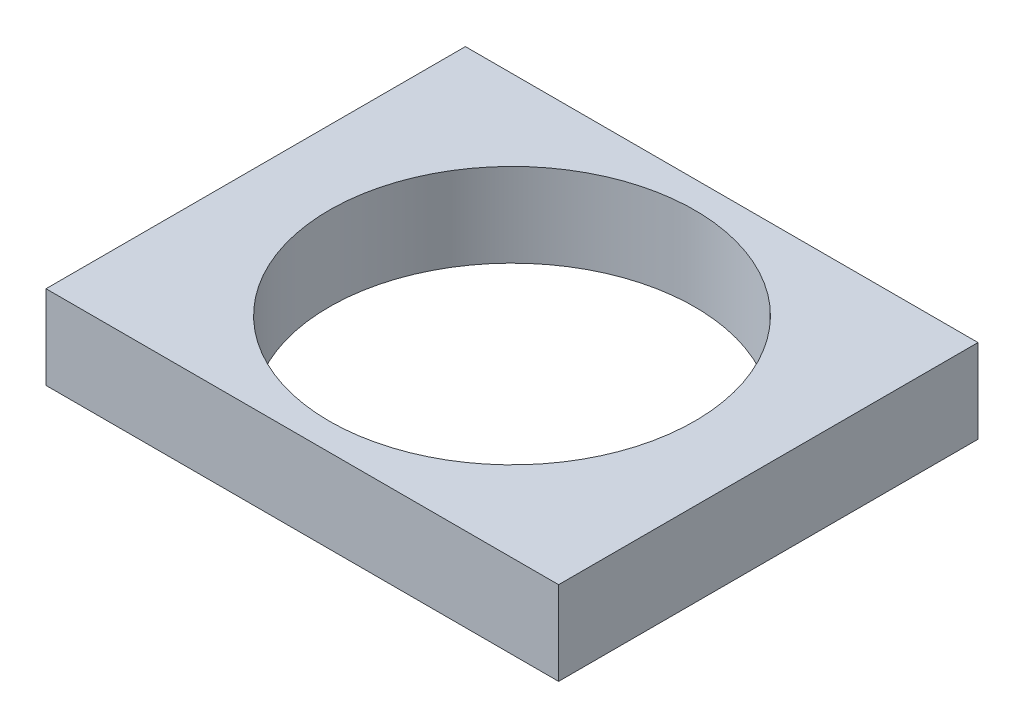
ISO-10303-21;
HEADER;
FILE_DESCRIPTION(('STEP AP214'),'2;1');
FILE_NAME('part.step','',(''),(''),'','','');
FILE_SCHEMA(('AUTOMOTIVE_DESIGN { 1 0 10303 214 1 1 1 1 }'));
ENDSEC;
DATA;
#1=APPLICATION_CONTEXT('core data for automotive mechanical design processes');
#2=APPLICATION_PROTOCOL_DEFINITION('international standard','automotive_design',2000,#1);
#3=PRODUCT_CONTEXT('',#1,'mechanical');
#4=PRODUCT('Part','Part','',(#3));
#5=PRODUCT_RELATED_PRODUCT_CATEGORY('part','',(#4));
#6=PRODUCT_DEFINITION_FORMATION('','',#4);
#7=PRODUCT_DEFINITION_CONTEXT('part definition',#1,'design');
#8=PRODUCT_DEFINITION('design','',#6,#7);
#9=PRODUCT_DEFINITION_SHAPE('','',#8);
#10=(LENGTH_UNIT() NAMED_UNIT(*) SI_UNIT(.MILLI.,.METRE.));
#11=(NAMED_UNIT(*) PLANE_ANGLE_UNIT() SI_UNIT($,.RADIAN.));
#12=(NAMED_UNIT(*) SI_UNIT($,.STERADIAN.) SOLID_ANGLE_UNIT());
#13=UNCERTAINTY_MEASURE_WITH_UNIT(LENGTH_MEASURE(1.E-05),#10,'distance_accuracy_value','');
#14=(GEOMETRIC_REPRESENTATION_CONTEXT(3) GLOBAL_UNCERTAINTY_ASSIGNED_CONTEXT((#13)) GLOBAL_UNIT_ASSIGNED_CONTEXT((#10,
#11,#12)) REPRESENTATION_CONTEXT('',''));
#15=CARTESIAN_POINT('',(0.,0.,0.));
#16=DIRECTION('',(0.,0.,1.));
#17=DIRECTION('',(1.,0.,0.));
#18=AXIS2_PLACEMENT_3D('',#15,#16,#17);
#19=CARTESIAN_POINT('',(0.,10.,0.));
#20=DIRECTION('',(0.,1.,0.));
#21=DIRECTION('',(0.,0.,1.));
#22=AXIS2_PLACEMENT_3D('',#19,#20,#21);
#23=PLANE('',#22);
#24=DIRECTION('',(0.,0.,1.));
#25=VECTOR('',#24,1.);
#26=CARTESIAN_POINT('',(-51.0541790263166,10.,-17.978222575415));
#27=LINE('',#26,#25);
#28=CARTESIAN_POINT('',(-51.0541790263166,10.,-17.978222575415));
#29=VERTEX_POINT('',#28);
#30=CARTESIAN_POINT('',(-51.0541790263166,10.,32.082684485409));
#31=VERTEX_POINT('',#30);
#32=EDGE_CURVE('E92',#29,#31,#27,.T.);
#33=ORIENTED_EDGE('',*,*,#32,.T.);
#34=DIRECTION('',(1.,0.,0.));
#35=VECTOR('',#34,1.);
#36=CARTESIAN_POINT('',(-51.0541790263166,10.,32.082684485409));
#37=LINE('',#36,#35);
#38=CARTESIAN_POINT('',(10.1313740480239,10.,32.082684485409));
#39=VERTEX_POINT('',#38);
#40=EDGE_CURVE('E87',#31,#39,#37,.T.);
#41=ORIENTED_EDGE('',*,*,#40,.T.);
#42=DIRECTION('',(0.,0.,-1.));
#43=VECTOR('',#42,1.);
#44=CARTESIAN_POINT('',(10.1313740480239,10.,-17.978222575415));
#45=LINE('',#44,#43);
#46=CARTESIAN_POINT('',(10.1313740480239,10.,-17.978222575415));
#47=VERTEX_POINT('',#46);
#48=EDGE_CURVE('E90',#39,#47,#45,.T.);
#49=ORIENTED_EDGE('',*,*,#48,.T.);
#50=DIRECTION('',(-1.,0.,0.));
#51=VECTOR('',#50,1.);
#52=CARTESIAN_POINT('',(-51.0541790263166,10.,-17.978222575415));
#53=LINE('',#52,#51);
#54=EDGE_CURVE('E57',#47,#29,#53,.T.);
#55=ORIENTED_EDGE('',*,*,#54,.T.);
#56=EDGE_LOOP('',(#33,#41,#49,#55));
#57=FACE_BOUND('',#56,.T.);
#58=CARTESIAN_POINT('',(-20.4614024891464,10.,7.05223095499703));
#59=DIRECTION('',(0.,1.,0.));
#60=DIRECTION('',(0.,0.,1.));
#61=AXIS2_PLACEMENT_3D('',#58,#59,#60);
#62=CIRCLE('',#61,21.8140253439407);
#63=CARTESIAN_POINT('',(-20.4614024891464,10.,28.8662562989377));
#64=VERTEX_POINT('',#63);
#65=EDGE_CURVE('E112',#64,#64,#62,.T.);
#66=ORIENTED_EDGE('',*,*,#65,.F.);
#67=EDGE_LOOP('',(#66));
#68=FACE_BOUND('',#67,.T.);
#69=ADVANCED_FACE('F39',(#57,#68),#23,.T.);
#70=CARTESIAN_POINT('',(0.,0.,0.));
#71=DIRECTION('',(0.,1.,0.));
#72=DIRECTION('',(0.,0.,1.));
#73=AXIS2_PLACEMENT_3D('',#70,#71,#72);
#74=PLANE('',#73);
#75=DIRECTION('',(0.,0.,1.));
#76=VECTOR('',#75,1.);
#77=CARTESIAN_POINT('',(-51.0541790263166,0.,-17.978222575415));
#78=LINE('',#77,#76);
#79=CARTESIAN_POINT('',(-51.0541790263166,0.,-17.978222575415));
#80=VERTEX_POINT('',#79);
#81=CARTESIAN_POINT('',(-51.0541790263166,0.,32.082684485409));
#82=VERTEX_POINT('',#81);
#83=EDGE_CURVE('E108',#80,#82,#78,.T.);
#84=ORIENTED_EDGE('',*,*,#83,.F.);
#85=DIRECTION('',(-1.,0.,0.));
#86=VECTOR('',#85,1.);
#87=CARTESIAN_POINT('',(-51.0541790263166,0.,-17.978222575415));
#88=LINE('',#87,#86);
#89=CARTESIAN_POINT('',(10.1313740480239,0.,-17.978222575415));
#90=VERTEX_POINT('',#89);
#91=EDGE_CURVE('E80',#90,#80,#88,.T.);
#92=ORIENTED_EDGE('',*,*,#91,.F.);
#93=DIRECTION('',(0.,0.,-1.));
#94=VECTOR('',#93,1.);
#95=CARTESIAN_POINT('',(10.1313740480239,0.,-17.978222575415));
#96=LINE('',#95,#94);
#97=CARTESIAN_POINT('',(10.1313740480239,0.,32.082684485409));
#98=VERTEX_POINT('',#97);
#99=EDGE_CURVE('E74',#98,#90,#96,.T.);
#100=ORIENTED_EDGE('',*,*,#99,.F.);
#101=DIRECTION('',(1.,0.,0.));
#102=VECTOR('',#101,1.);
#103=CARTESIAN_POINT('',(-51.0541790263166,0.,32.082684485409));
#104=LINE('',#103,#102);
#105=EDGE_CURVE('E97',#82,#98,#104,.T.);
#106=ORIENTED_EDGE('',*,*,#105,.F.);
#107=EDGE_LOOP('',(#84,#92,#100,#106));
#108=FACE_BOUND('',#107,.T.);
#109=CARTESIAN_POINT('',(-20.4614024891464,0.,7.05223095499703));
#110=DIRECTION('',(0.,1.,0.));
#111=DIRECTION('',(0.,0.,1.));
#112=AXIS2_PLACEMENT_3D('',#109,#110,#111);
#113=CIRCLE('',#112,21.8140253439407);
#114=CARTESIAN_POINT('',(-20.4614024891464,0.,28.8662562989377));
#115=VERTEX_POINT('',#114);
#116=EDGE_CURVE('E130',#115,#115,#113,.T.);
#117=ORIENTED_EDGE('',*,*,#116,.T.);
#118=EDGE_LOOP('',(#117));
#119=FACE_BOUND('',#118,.T.);
#120=ADVANCED_FACE('F125',(#108,#119),#74,.F.);
#121=CARTESIAN_POINT('',(-51.0541790263166,10.,-17.978222575415));
#122=DIRECTION('',(1.,0.,0.));
#123=DIRECTION('',(0.,0.,-1.));
#124=AXIS2_PLACEMENT_3D('',#121,#122,#123);
#125=PLANE('',#124);
#126=ORIENTED_EDGE('',*,*,#83,.T.);
#127=DIRECTION('',(0.,-1.,0.));
#128=VECTOR('',#127,1.);
#129=CARTESIAN_POINT('',(-51.0541790263166,10.,32.082684485409));
#130=LINE('',#129,#128);
#131=EDGE_CURVE('E11',#31,#82,#130,.T.);
#132=ORIENTED_EDGE('',*,*,#131,.F.);
#133=ORIENTED_EDGE('',*,*,#32,.F.);
#134=DIRECTION('',(0.,-1.,0.));
#135=VECTOR('',#134,1.);
#136=CARTESIAN_POINT('',(-51.0541790263166,10.,-17.978222575415));
#137=LINE('',#136,#135);
#138=EDGE_CURVE('E104',#29,#80,#137,.T.);
#139=ORIENTED_EDGE('',*,*,#138,.T.);
#140=EDGE_LOOP('',(#126,#132,#133,#139));
#141=FACE_BOUND('',#140,.T.);
#142=ADVANCED_FACE('F41',(#141),#125,.F.);
#143=CARTESIAN_POINT('',(-51.0541790263166,10.,32.082684485409));
#144=DIRECTION('',(0.,0.,-1.));
#145=DIRECTION('',(-1.,0.,0.));
#146=AXIS2_PLACEMENT_3D('',#143,#144,#145);
#147=PLANE('',#146);
#148=ORIENTED_EDGE('',*,*,#105,.T.);
#149=DIRECTION('',(0.,-1.,0.));
#150=VECTOR('',#149,1.);
#151=CARTESIAN_POINT('',(10.1313740480239,10.,32.082684485409));
#152=LINE('',#151,#150);
#153=EDGE_CURVE('E49',#39,#98,#152,.T.);
#154=ORIENTED_EDGE('',*,*,#153,.F.);
#155=ORIENTED_EDGE('',*,*,#40,.F.);
#156=ORIENTED_EDGE('',*,*,#131,.T.);
#157=EDGE_LOOP('',(#148,#154,#155,#156));
#158=FACE_BOUND('',#157,.T.);
#159=ADVANCED_FACE('F96',(#158),#147,.F.);
#160=CARTESIAN_POINT('',(10.1313740480239,10.,-17.978222575415));
#161=DIRECTION('',(-1.,0.,0.));
#162=DIRECTION('',(0.,0.,1.));
#163=AXIS2_PLACEMENT_3D('',#160,#161,#162);
#164=PLANE('',#163);
#165=ORIENTED_EDGE('',*,*,#99,.T.);
#166=DIRECTION('',(0.,-1.,0.));
#167=VECTOR('',#166,1.);
#168=CARTESIAN_POINT('',(10.1313740480239,10.,-17.978222575415));
#169=LINE('',#168,#167);
#170=EDGE_CURVE('E99',#47,#90,#169,.T.);
#171=ORIENTED_EDGE('',*,*,#170,.F.);
#172=ORIENTED_EDGE('',*,*,#48,.F.);
#173=ORIENTED_EDGE('',*,*,#153,.T.);
#174=EDGE_LOOP('',(#165,#171,#172,#173));
#175=FACE_BOUND('',#174,.T.);
#176=ADVANCED_FACE('F100',(#175),#164,.F.);
#177=CARTESIAN_POINT('',(-51.0541790263166,10.,-17.978222575415));
#178=DIRECTION('',(0.,0.,1.));
#179=DIRECTION('',(1.,0.,0.));
#180=AXIS2_PLACEMENT_3D('',#177,#178,#179);
#181=PLANE('',#180);
#182=ORIENTED_EDGE('',*,*,#91,.T.);
#183=ORIENTED_EDGE('',*,*,#138,.F.);
#184=ORIENTED_EDGE('',*,*,#54,.F.);
#185=ORIENTED_EDGE('',*,*,#170,.T.);
#186=EDGE_LOOP('',(#182,#183,#184,#185));
#187=FACE_BOUND('',#186,.T.);
#188=ADVANCED_FACE('F122',(#187),#181,.F.);
#189=CARTESIAN_POINT('',(-20.4614024891464,10.,7.05223095499703));
#190=DIRECTION('',(0.,-1.,0.));
#191=DIRECTION('',(0.,0.,-1.));
#192=AXIS2_PLACEMENT_3D('',#189,#190,#191);
#193=CYLINDRICAL_SURFACE('',#192,21.8140253439407);
#194=ORIENTED_EDGE('',*,*,#65,.T.);
#195=EDGE_LOOP('',(#194));
#196=FACE_BOUND('',#195,.T.);
#197=ORIENTED_EDGE('',*,*,#116,.F.);
#198=EDGE_LOOP('',(#197));
#199=FACE_BOUND('',#198,.T.);
#200=ADVANCED_FACE('F138',(#196,#199),#193,.F.);
#201=CLOSED_SHELL('',(#69,#120,#142,#159,#176,#188,#200));
#202=MANIFOLD_SOLID_BREP('B2',#201);
#203=ADVANCED_BREP_SHAPE_REPRESENTATION('',(#18,#202),#14);
#204=SHAPE_DEFINITION_REPRESENTATION(#9,#203);
ENDSEC;
END-ISO-10303-21;
